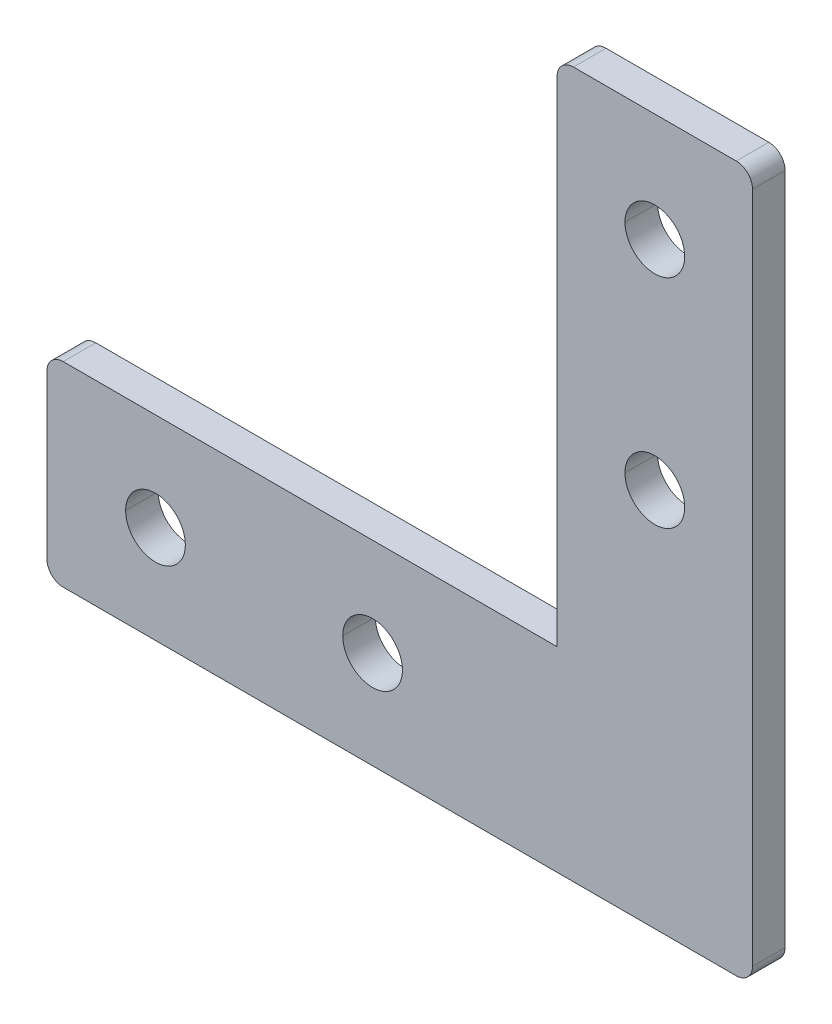
ISO-10303-21;
HEADER;
FILE_DESCRIPTION(('STEP AP214'),'2;1');
FILE_NAME('part.step','',(''),(''),'','','');
FILE_SCHEMA(('AUTOMOTIVE_DESIGN { 1 0 10303 214 1 1 1 1 }'));
ENDSEC;
DATA;
#1=APPLICATION_CONTEXT('core data for automotive mechanical design processes');
#2=APPLICATION_PROTOCOL_DEFINITION('international standard','automotive_design',2000,#1);
#3=PRODUCT_CONTEXT('',#1,'mechanical');
#4=PRODUCT('Part','Part','',(#3));
#5=PRODUCT_RELATED_PRODUCT_CATEGORY('part','',(#4));
#6=PRODUCT_DEFINITION_FORMATION('','',#4);
#7=PRODUCT_DEFINITION_CONTEXT('part definition',#1,'design');
#8=PRODUCT_DEFINITION('design','',#6,#7);
#9=PRODUCT_DEFINITION_SHAPE('','',#8);
#10=(LENGTH_UNIT() NAMED_UNIT(*) SI_UNIT(.MILLI.,.METRE.));
#11=(NAMED_UNIT(*) PLANE_ANGLE_UNIT() SI_UNIT($,.RADIAN.));
#12=(NAMED_UNIT(*) SI_UNIT($,.STERADIAN.) SOLID_ANGLE_UNIT());
#13=UNCERTAINTY_MEASURE_WITH_UNIT(LENGTH_MEASURE(1.E-05),#10,'distance_accuracy_value','');
#14=(GEOMETRIC_REPRESENTATION_CONTEXT(3) GLOBAL_UNCERTAINTY_ASSIGNED_CONTEXT((#13)) GLOBAL_UNIT_ASSIGNED_CONTEXT((#10,
#11,#12)) REPRESENTATION_CONTEXT('',''));
#15=CARTESIAN_POINT('',(0.,0.,0.));
#16=DIRECTION('',(0.,0.,1.));
#17=DIRECTION('',(1.,0.,0.));
#18=AXIS2_PLACEMENT_3D('',#15,#16,#17);
#19=CARTESIAN_POINT('',(56.,55.,-3.));
#20=DIRECTION('',(0.,0.,1.));
#21=DIRECTION('',(1.,0.,0.));
#22=AXIS2_PLACEMENT_3D('',#19,#20,#21);
#23=CYLINDRICAL_SURFACE('',#22,2.75);
#24=DIRECTION('',(0.,0.,1.));
#25=VECTOR('',#24,1.);
#26=CARTESIAN_POINT('',(53.25,55.,-3.));
#27=LINE('',#26,#25);
#28=CARTESIAN_POINT('',(53.25,55.,-3.));
#29=VERTEX_POINT('',#28);
#30=CARTESIAN_POINT('',(53.25,55.,0.));
#31=VERTEX_POINT('',#30);
#32=EDGE_CURVE('E266',#29,#31,#27,.T.);
#33=ORIENTED_EDGE('',*,*,#32,.F.);
#34=CARTESIAN_POINT('',(56.,55.,-3.));
#35=DIRECTION('',(0.,0.,1.));
#36=DIRECTION('',(1.,0.,0.));
#37=AXIS2_PLACEMENT_3D('',#34,#35,#36);
#38=CIRCLE('',#37,2.75);
#39=CARTESIAN_POINT('',(58.75,55.,-3.));
#40=VERTEX_POINT('',#39);
#41=EDGE_CURVE('E378',#40,#29,#38,.T.);
#42=ORIENTED_EDGE('',*,*,#41,.F.);
#43=DIRECTION('',(0.,0.,1.));
#44=VECTOR('',#43,1.);
#45=CARTESIAN_POINT('',(58.75,55.,-3.));
#46=LINE('',#45,#44);
#47=CARTESIAN_POINT('',(58.75,55.,0.));
#48=VERTEX_POINT('',#47);
#49=EDGE_CURVE('E229',#40,#48,#46,.T.);
#50=ORIENTED_EDGE('',*,*,#49,.T.);
#51=CARTESIAN_POINT('',(56.,55.,0.));
#52=DIRECTION('',(0.,0.,1.));
#53=DIRECTION('',(1.,0.,0.));
#54=AXIS2_PLACEMENT_3D('',#51,#52,#53);
#55=CIRCLE('',#54,2.75);
#56=EDGE_CURVE('E212',#48,#31,#55,.T.);
#57=ORIENTED_EDGE('',*,*,#56,.T.);
#58=EDGE_LOOP('',(#33,#42,#50,#57));
#59=FACE_BOUND('',#58,.T.);
#60=ADVANCED_FACE('F16',(#59),#23,.F.);
#61=CARTESIAN_POINT('',(56.,35.,-3.));
#62=DIRECTION('',(0.,0.,1.));
#63=DIRECTION('',(1.,0.,0.));
#64=AXIS2_PLACEMENT_3D('',#61,#62,#63);
#65=CYLINDRICAL_SURFACE('',#64,2.75);
#66=DIRECTION('',(0.,0.,1.));
#67=VECTOR('',#66,1.);
#68=CARTESIAN_POINT('',(53.25,35.,-3.));
#69=LINE('',#68,#67);
#70=CARTESIAN_POINT('',(53.25,35.,-3.));
#71=VERTEX_POINT('',#70);
#72=CARTESIAN_POINT('',(53.25,35.,0.));
#73=VERTEX_POINT('',#72);
#74=EDGE_CURVE('E205',#71,#73,#69,.T.);
#75=ORIENTED_EDGE('',*,*,#74,.F.);
#76=CARTESIAN_POINT('',(56.,35.,-3.));
#77=DIRECTION('',(0.,0.,1.));
#78=DIRECTION('',(1.,0.,0.));
#79=AXIS2_PLACEMENT_3D('',#76,#77,#78);
#80=CIRCLE('',#79,2.75);
#81=CARTESIAN_POINT('',(58.75,35.,-3.));
#82=VERTEX_POINT('',#81);
#83=EDGE_CURVE('E258',#82,#71,#80,.T.);
#84=ORIENTED_EDGE('',*,*,#83,.F.);
#85=DIRECTION('',(0.,0.,1.));
#86=VECTOR('',#85,1.);
#87=CARTESIAN_POINT('',(58.75,35.,-3.));
#88=LINE('',#87,#86);
#89=CARTESIAN_POINT('',(58.75,35.,0.));
#90=VERTEX_POINT('',#89);
#91=EDGE_CURVE('E208',#82,#90,#88,.T.);
#92=ORIENTED_EDGE('',*,*,#91,.T.);
#93=CARTESIAN_POINT('',(56.,35.,0.));
#94=DIRECTION('',(0.,0.,1.));
#95=DIRECTION('',(1.,0.,0.));
#96=AXIS2_PLACEMENT_3D('',#93,#94,#95);
#97=CIRCLE('',#96,2.75);
#98=EDGE_CURVE('E201',#90,#73,#97,.T.);
#99=ORIENTED_EDGE('',*,*,#98,.T.);
#100=EDGE_LOOP('',(#75,#84,#92,#99));
#101=FACE_BOUND('',#100,.T.);
#102=ADVANCED_FACE('F203',(#101),#65,.F.);
#103=CARTESIAN_POINT('',(30.,9.,-3.));
#104=DIRECTION('',(0.,0.,1.));
#105=DIRECTION('',(1.,0.,0.));
#106=AXIS2_PLACEMENT_3D('',#103,#104,#105);
#107=CYLINDRICAL_SURFACE('',#106,2.75);
#108=DIRECTION('',(0.,0.,1.));
#109=VECTOR('',#108,1.);
#110=CARTESIAN_POINT('',(27.25,9.,-3.));
#111=LINE('',#110,#109);
#112=CARTESIAN_POINT('',(27.25,9.,-3.));
#113=VERTEX_POINT('',#112);
#114=CARTESIAN_POINT('',(27.25,9.,0.));
#115=VERTEX_POINT('',#114);
#116=EDGE_CURVE('E314',#113,#115,#111,.T.);
#117=ORIENTED_EDGE('',*,*,#116,.F.);
#118=CARTESIAN_POINT('',(30.,9.,-3.));
#119=DIRECTION('',(0.,0.,1.));
#120=DIRECTION('',(1.,0.,0.));
#121=AXIS2_PLACEMENT_3D('',#118,#119,#120);
#122=CIRCLE('',#121,2.75);
#123=CARTESIAN_POINT('',(32.75,9.,-3.));
#124=VERTEX_POINT('',#123);
#125=EDGE_CURVE('E254',#124,#113,#122,.T.);
#126=ORIENTED_EDGE('',*,*,#125,.F.);
#127=DIRECTION('',(0.,0.,1.));
#128=VECTOR('',#127,1.);
#129=CARTESIAN_POINT('',(32.75,9.,-3.));
#130=LINE('',#129,#128);
#131=CARTESIAN_POINT('',(32.75,9.,0.));
#132=VERTEX_POINT('',#131);
#133=EDGE_CURVE('E285',#124,#132,#130,.T.);
#134=ORIENTED_EDGE('',*,*,#133,.T.);
#135=CARTESIAN_POINT('',(30.,9.,0.));
#136=DIRECTION('',(0.,0.,1.));
#137=DIRECTION('',(1.,0.,0.));
#138=AXIS2_PLACEMENT_3D('',#135,#136,#137);
#139=CIRCLE('',#138,2.75);
#140=EDGE_CURVE('E27',#132,#115,#139,.T.);
#141=ORIENTED_EDGE('',*,*,#140,.T.);
#142=EDGE_LOOP('',(#117,#126,#134,#141));
#143=FACE_BOUND('',#142,.T.);
#144=ADVANCED_FACE('F694',(#143),#107,.F.);
#145=CARTESIAN_POINT('',(10.,9.,-3.));
#146=DIRECTION('',(0.,0.,1.));
#147=DIRECTION('',(1.,0.,0.));
#148=AXIS2_PLACEMENT_3D('',#145,#146,#147);
#149=CYLINDRICAL_SURFACE('',#148,2.75);
#150=DIRECTION('',(0.,0.,1.));
#151=VECTOR('',#150,1.);
#152=CARTESIAN_POINT('',(7.25,9.,-3.));
#153=LINE('',#152,#151);
#154=CARTESIAN_POINT('',(7.25,9.,-3.));
#155=VERTEX_POINT('',#154);
#156=CARTESIAN_POINT('',(7.25,9.,0.));
#157=VERTEX_POINT('',#156);
#158=EDGE_CURVE('E313',#155,#157,#153,.T.);
#159=ORIENTED_EDGE('',*,*,#158,.F.);
#160=CARTESIAN_POINT('',(10.,9.,-3.));
#161=DIRECTION('',(0.,0.,1.));
#162=DIRECTION('',(1.,0.,0.));
#163=AXIS2_PLACEMENT_3D('',#160,#161,#162);
#164=CIRCLE('',#163,2.75);
#165=CARTESIAN_POINT('',(12.75,9.,-3.));
#166=VERTEX_POINT('',#165);
#167=EDGE_CURVE('E257',#166,#155,#164,.T.);
#168=ORIENTED_EDGE('',*,*,#167,.F.);
#169=DIRECTION('',(0.,0.,1.));
#170=VECTOR('',#169,1.);
#171=CARTESIAN_POINT('',(12.75,9.,-3.));
#172=LINE('',#171,#170);
#173=CARTESIAN_POINT('',(12.75,9.,0.));
#174=VERTEX_POINT('',#173);
#175=EDGE_CURVE('E272',#166,#174,#172,.T.);
#176=ORIENTED_EDGE('',*,*,#175,.T.);
#177=CARTESIAN_POINT('',(10.,9.,0.));
#178=DIRECTION('',(0.,0.,1.));
#179=DIRECTION('',(1.,0.,0.));
#180=AXIS2_PLACEMENT_3D('',#177,#178,#179);
#181=CIRCLE('',#180,2.75);
#182=EDGE_CURVE('E10',#174,#157,#181,.T.);
#183=ORIENTED_EDGE('',*,*,#182,.T.);
#184=EDGE_LOOP('',(#159,#168,#176,#183));
#185=FACE_BOUND('',#184,.T.);
#186=ADVANCED_FACE('F685',(#185),#149,.F.);
#187=CARTESIAN_POINT('',(1.5,16.5,0.));
#188=DIRECTION('',(0.,0.,1.));
#189=DIRECTION('',(1.,0.,0.));
#190=AXIS2_PLACEMENT_3D('',#187,#188,#189);
#191=PLANE('',#190);
#192=ORIENTED_EDGE('',*,*,#182,.F.);
#193=CARTESIAN_POINT('',(10.,9.,0.));
#194=DIRECTION('',(0.,0.,1.));
#195=DIRECTION('',(1.,0.,0.));
#196=AXIS2_PLACEMENT_3D('',#193,#194,#195);
#197=CIRCLE('',#196,2.75);
#198=EDGE_CURVE('E276',#157,#174,#197,.T.);
#199=ORIENTED_EDGE('',*,*,#198,.F.);
#200=EDGE_LOOP('',(#192,#199));
#201=FACE_BOUND('',#200,.T.);
#202=ORIENTED_EDGE('',*,*,#140,.F.);
#203=CARTESIAN_POINT('',(30.,9.,0.));
#204=DIRECTION('',(0.,0.,1.));
#205=DIRECTION('',(1.,0.,0.));
#206=AXIS2_PLACEMENT_3D('',#203,#204,#205);
#207=CIRCLE('',#206,2.75);
#208=EDGE_CURVE('E290',#115,#132,#207,.T.);
#209=ORIENTED_EDGE('',*,*,#208,.F.);
#210=EDGE_LOOP('',(#202,#209));
#211=FACE_BOUND('',#210,.T.);
#212=ORIENTED_EDGE('',*,*,#98,.F.);
#213=CARTESIAN_POINT('',(56.,35.,0.));
#214=DIRECTION('',(0.,0.,1.));
#215=DIRECTION('',(1.,0.,0.));
#216=AXIS2_PLACEMENT_3D('',#213,#214,#215);
#217=CIRCLE('',#216,2.75);
#218=EDGE_CURVE('E214',#73,#90,#217,.T.);
#219=ORIENTED_EDGE('',*,*,#218,.F.);
#220=EDGE_LOOP('',(#212,#219));
#221=FACE_BOUND('',#220,.T.);
#222=ORIENTED_EDGE('',*,*,#56,.F.);
#223=CARTESIAN_POINT('',(56.,55.,0.));
#224=DIRECTION('',(0.,0.,1.));
#225=DIRECTION('',(1.,0.,0.));
#226=AXIS2_PLACEMENT_3D('',#223,#224,#225);
#227=CIRCLE('',#226,2.75);
#228=EDGE_CURVE('E269',#31,#48,#227,.T.);
#229=ORIENTED_EDGE('',*,*,#228,.F.);
#230=EDGE_LOOP('',(#222,#229));
#231=FACE_BOUND('',#230,.T.);
#232=CARTESIAN_POINT('',(1.5,16.5,0.));
#233=DIRECTION('',(0.,0.,1.));
#234=DIRECTION('',(1.,0.,0.));
#235=AXIS2_PLACEMENT_3D('',#232,#233,#234);
#236=CIRCLE('',#235,1.5);
#237=CARTESIAN_POINT('',(1.5,18.,0.));
#238=VERTEX_POINT('',#237);
#239=CARTESIAN_POINT('',(0.,16.5,0.));
#240=VERTEX_POINT('',#239);
#241=EDGE_CURVE('E244',#238,#240,#236,.T.);
#242=ORIENTED_EDGE('',*,*,#241,.T.);
#243=DIRECTION('',(0.,-1.,0.));
#244=VECTOR('',#243,1.);
#245=CARTESIAN_POINT('',(0.,16.5,0.));
#246=LINE('',#245,#244);
#247=CARTESIAN_POINT('',(0.,1.5,0.));
#248=VERTEX_POINT('',#247);
#249=EDGE_CURVE('E281',#240,#248,#246,.T.);
#250=ORIENTED_EDGE('',*,*,#249,.T.);
#251=CARTESIAN_POINT('',(1.5,1.5,0.));
#252=DIRECTION('',(0.,0.,1.));
#253=DIRECTION('',(1.,0.,0.));
#254=AXIS2_PLACEMENT_3D('',#251,#252,#253);
#255=CIRCLE('',#254,1.5);
#256=CARTESIAN_POINT('',(1.5,0.,0.));
#257=VERTEX_POINT('',#256);
#258=EDGE_CURVE('E294',#248,#257,#255,.T.);
#259=ORIENTED_EDGE('',*,*,#258,.T.);
#260=DIRECTION('',(1.,0.,0.));
#261=VECTOR('',#260,1.);
#262=CARTESIAN_POINT('',(1.5,0.,0.));
#263=LINE('',#262,#261);
#264=CARTESIAN_POINT('',(63.5,0.,0.));
#265=VERTEX_POINT('',#264);
#266=EDGE_CURVE('E264',#257,#265,#263,.T.);
#267=ORIENTED_EDGE('',*,*,#266,.T.);
#268=CARTESIAN_POINT('',(63.5,1.5,0.));
#269=DIRECTION('',(0.,0.,1.));
#270=DIRECTION('',(1.,0.,0.));
#271=AXIS2_PLACEMENT_3D('',#268,#269,#270);
#272=CIRCLE('',#271,1.5);
#273=CARTESIAN_POINT('',(65.,1.5,0.));
#274=VERTEX_POINT('',#273);
#275=EDGE_CURVE('E402',#265,#274,#272,.T.);
#276=ORIENTED_EDGE('',*,*,#275,.T.);
#277=DIRECTION('',(0.,1.,0.));
#278=VECTOR('',#277,1.);
#279=CARTESIAN_POINT('',(65.,1.5,0.));
#280=LINE('',#279,#278);
#281=CARTESIAN_POINT('',(65.,63.5,0.));
#282=VERTEX_POINT('',#281);
#283=EDGE_CURVE('E329',#274,#282,#280,.T.);
#284=ORIENTED_EDGE('',*,*,#283,.T.);
#285=CARTESIAN_POINT('',(63.5,63.5,0.));
#286=DIRECTION('',(0.,0.,1.));
#287=DIRECTION('',(1.,0.,0.));
#288=AXIS2_PLACEMENT_3D('',#285,#286,#287);
#289=CIRCLE('',#288,1.5);
#290=CARTESIAN_POINT('',(63.5,65.,0.));
#291=VERTEX_POINT('',#290);
#292=EDGE_CURVE('E114',#282,#291,#289,.T.);
#293=ORIENTED_EDGE('',*,*,#292,.T.);
#294=DIRECTION('',(-1.,0.,0.));
#295=VECTOR('',#294,1.);
#296=CARTESIAN_POINT('',(63.5,65.,0.));
#297=LINE('',#296,#295);
#298=CARTESIAN_POINT('',(48.5,65.,0.));
#299=VERTEX_POINT('',#298);
#300=EDGE_CURVE('E298',#291,#299,#297,.T.);
#301=ORIENTED_EDGE('',*,*,#300,.T.);
#302=CARTESIAN_POINT('',(48.5,63.5,0.));
#303=DIRECTION('',(0.,0.,1.));
#304=DIRECTION('',(-1.,0.,0.));
#305=AXIS2_PLACEMENT_3D('',#302,#303,#304);
#306=CIRCLE('',#305,1.5);
#307=CARTESIAN_POINT('',(47.,63.5,0.));
#308=VERTEX_POINT('',#307);
#309=EDGE_CURVE('E248',#299,#308,#306,.T.);
#310=ORIENTED_EDGE('',*,*,#309,.T.);
#311=DIRECTION('',(0.,-1.,0.));
#312=VECTOR('',#311,1.);
#313=CARTESIAN_POINT('',(47.,63.5,0.));
#314=LINE('',#313,#312);
#315=CARTESIAN_POINT('',(47.,18.,0.));
#316=VERTEX_POINT('',#315);
#317=EDGE_CURVE('E277',#308,#316,#314,.T.);
#318=ORIENTED_EDGE('',*,*,#317,.T.);
#319=DIRECTION('',(-1.,0.,0.));
#320=VECTOR('',#319,1.);
#321=CARTESIAN_POINT('',(47.,18.,0.));
#322=LINE('',#321,#320);
#323=EDGE_CURVE('E238',#316,#238,#322,.T.);
#324=ORIENTED_EDGE('',*,*,#323,.T.);
#325=EDGE_LOOP('',(#242,#250,#259,#267,#276,#284,#293,#301,#310,#318,#324));
#326=FACE_BOUND('',#325,.T.);
#327=ADVANCED_FACE('F215',(#201,#211,#221,#231,#326),#191,.T.);
#328=CARTESIAN_POINT('',(1.5,16.5,-3.));
#329=DIRECTION('',(0.,0.,1.));
#330=DIRECTION('',(1.,0.,0.));
#331=AXIS2_PLACEMENT_3D('',#328,#329,#330);
#332=PLANE('',#331);
#333=ORIENTED_EDGE('',*,*,#167,.T.);
#334=CARTESIAN_POINT('',(10.,9.,-3.));
#335=DIRECTION('',(0.,0.,1.));
#336=DIRECTION('',(1.,0.,0.));
#337=AXIS2_PLACEMENT_3D('',#334,#335,#336);
#338=CIRCLE('',#337,2.75);
#339=EDGE_CURVE('E289',#155,#166,#338,.T.);
#340=ORIENTED_EDGE('',*,*,#339,.T.);
#341=EDGE_LOOP('',(#333,#340));
#342=FACE_BOUND('',#341,.T.);
#343=ORIENTED_EDGE('',*,*,#125,.T.);
#344=CARTESIAN_POINT('',(30.,9.,-3.));
#345=DIRECTION('',(0.,0.,1.));
#346=DIRECTION('',(1.,0.,0.));
#347=AXIS2_PLACEMENT_3D('',#344,#345,#346);
#348=CIRCLE('',#347,2.75);
#349=EDGE_CURVE('E20',#113,#124,#348,.T.);
#350=ORIENTED_EDGE('',*,*,#349,.T.);
#351=EDGE_LOOP('',(#343,#350));
#352=FACE_BOUND('',#351,.T.);
#353=ORIENTED_EDGE('',*,*,#83,.T.);
#354=CARTESIAN_POINT('',(56.,35.,-3.));
#355=DIRECTION('',(0.,0.,1.));
#356=DIRECTION('',(1.,0.,0.));
#357=AXIS2_PLACEMENT_3D('',#354,#355,#356);
#358=CIRCLE('',#357,2.75);
#359=EDGE_CURVE('E222',#71,#82,#358,.T.);
#360=ORIENTED_EDGE('',*,*,#359,.T.);
#361=EDGE_LOOP('',(#353,#360));
#362=FACE_BOUND('',#361,.T.);
#363=ORIENTED_EDGE('',*,*,#41,.T.);
#364=CARTESIAN_POINT('',(56.,55.,-3.));
#365=DIRECTION('',(0.,0.,1.));
#366=DIRECTION('',(1.,0.,0.));
#367=AXIS2_PLACEMENT_3D('',#364,#365,#366);
#368=CIRCLE('',#367,2.75);
#369=EDGE_CURVE('E270',#29,#40,#368,.T.);
#370=ORIENTED_EDGE('',*,*,#369,.T.);
#371=EDGE_LOOP('',(#363,#370));
#372=FACE_BOUND('',#371,.T.);
#373=CARTESIAN_POINT('',(1.5,16.5,-3.));
#374=DIRECTION('',(0.,0.,1.));
#375=DIRECTION('',(1.,0.,0.));
#376=AXIS2_PLACEMENT_3D('',#373,#374,#375);
#377=CIRCLE('',#376,1.5);
#378=CARTESIAN_POINT('',(1.5,18.,-3.));
#379=VERTEX_POINT('',#378);
#380=CARTESIAN_POINT('',(0.,16.5,-3.));
#381=VERTEX_POINT('',#380);
#382=EDGE_CURVE('E239',#379,#381,#377,.T.);
#383=ORIENTED_EDGE('',*,*,#382,.F.);
#384=DIRECTION('',(-1.,0.,0.));
#385=VECTOR('',#384,1.);
#386=CARTESIAN_POINT('',(47.,18.,-3.));
#387=LINE('',#386,#385);
#388=CARTESIAN_POINT('',(47.,18.,-3.));
#389=VERTEX_POINT('',#388);
#390=EDGE_CURVE('E280',#389,#379,#387,.T.);
#391=ORIENTED_EDGE('',*,*,#390,.F.);
#392=DIRECTION('',(0.,-1.,0.));
#393=VECTOR('',#392,1.);
#394=CARTESIAN_POINT('',(47.,63.5,-3.));
#395=LINE('',#394,#393);
#396=CARTESIAN_POINT('',(47.,63.5,-3.));
#397=VERTEX_POINT('',#396);
#398=EDGE_CURVE('E245',#397,#389,#395,.T.);
#399=ORIENTED_EDGE('',*,*,#398,.F.);
#400=CARTESIAN_POINT('',(48.5,63.5,-3.));
#401=DIRECTION('',(0.,0.,1.));
#402=DIRECTION('',(-1.,0.,0.));
#403=AXIS2_PLACEMENT_3D('',#400,#401,#402);
#404=CIRCLE('',#403,1.5);
#405=CARTESIAN_POINT('',(48.5,65.,-3.));
#406=VERTEX_POINT('',#405);
#407=EDGE_CURVE('E295',#406,#397,#404,.T.);
#408=ORIENTED_EDGE('',*,*,#407,.F.);
#409=DIRECTION('',(-1.,0.,0.));
#410=VECTOR('',#409,1.);
#411=CARTESIAN_POINT('',(63.5,65.,-3.));
#412=LINE('',#411,#410);
#413=CARTESIAN_POINT('',(63.5,65.,-3.));
#414=VERTEX_POINT('',#413);
#415=EDGE_CURVE('E253',#414,#406,#412,.T.);
#416=ORIENTED_EDGE('',*,*,#415,.F.);
#417=CARTESIAN_POINT('',(63.5,63.5,-3.));
#418=DIRECTION('',(0.,0.,1.));
#419=DIRECTION('',(1.,0.,0.));
#420=AXIS2_PLACEMENT_3D('',#417,#418,#419);
#421=CIRCLE('',#420,1.5);
#422=CARTESIAN_POINT('',(65.,63.5,-3.));
#423=VERTEX_POINT('',#422);
#424=EDGE_CURVE('E126',#423,#414,#421,.T.);
#425=ORIENTED_EDGE('',*,*,#424,.F.);
#426=DIRECTION('',(0.,1.,0.));
#427=VECTOR('',#426,1.);
#428=CARTESIAN_POINT('',(65.,1.5,-3.));
#429=LINE('',#428,#427);
#430=CARTESIAN_POINT('',(65.,1.5,-3.));
#431=VERTEX_POINT('',#430);
#432=EDGE_CURVE('E334',#431,#423,#429,.T.);
#433=ORIENTED_EDGE('',*,*,#432,.F.);
#434=CARTESIAN_POINT('',(63.5,1.5,-3.));
#435=DIRECTION('',(0.,0.,1.));
#436=DIRECTION('',(1.,0.,0.));
#437=AXIS2_PLACEMENT_3D('',#434,#435,#436);
#438=CIRCLE('',#437,1.5);
#439=CARTESIAN_POINT('',(63.5,0.,-3.));
#440=VERTEX_POINT('',#439);
#441=EDGE_CURVE('E261',#440,#431,#438,.T.);
#442=ORIENTED_EDGE('',*,*,#441,.F.);
#443=DIRECTION('',(1.,0.,0.));
#444=VECTOR('',#443,1.);
#445=CARTESIAN_POINT('',(1.5,0.,-3.));
#446=LINE('',#445,#444);
#447=CARTESIAN_POINT('',(1.5,0.,-3.));
#448=VERTEX_POINT('',#447);
#449=EDGE_CURVE('E304',#448,#440,#446,.T.);
#450=ORIENTED_EDGE('',*,*,#449,.F.);
#451=CARTESIAN_POINT('',(1.5,1.5,-3.));
#452=DIRECTION('',(0.,0.,1.));
#453=DIRECTION('',(1.,0.,0.));
#454=AXIS2_PLACEMENT_3D('',#451,#452,#453);
#455=CIRCLE('',#454,1.5);
#456=CARTESIAN_POINT('',(0.,1.5,-3.));
#457=VERTEX_POINT('',#456);
#458=EDGE_CURVE('E284',#457,#448,#455,.T.);
#459=ORIENTED_EDGE('',*,*,#458,.F.);
#460=DIRECTION('',(0.,-1.,0.));
#461=VECTOR('',#460,1.);
#462=CARTESIAN_POINT('',(0.,16.5,-3.));
#463=LINE('',#462,#461);
#464=EDGE_CURVE('E42',#381,#457,#463,.T.);
#465=ORIENTED_EDGE('',*,*,#464,.F.);
#466=EDGE_LOOP('',(#383,#391,#399,#408,#416,#425,#433,#442,#450,#459,#465));
#467=FACE_BOUND('',#466,.T.);
#468=ADVANCED_FACE('F426',(#342,#352,#362,#372,#467),#332,.F.);
#469=CARTESIAN_POINT('',(0.,16.5,-3.));
#470=DIRECTION('',(-1.,0.,0.));
#471=DIRECTION('',(0.,0.,1.));
#472=AXIS2_PLACEMENT_3D('',#469,#470,#471);
#473=PLANE('',#472);
#474=ORIENTED_EDGE('',*,*,#249,.F.);
#475=DIRECTION('',(0.,0.,1.));
#476=VECTOR('',#475,1.);
#477=CARTESIAN_POINT('',(0.,16.5,-3.));
#478=LINE('',#477,#476);
#479=EDGE_CURVE('E234',#381,#240,#478,.T.);
#480=ORIENTED_EDGE('',*,*,#479,.F.);
#481=ORIENTED_EDGE('',*,*,#464,.T.);
#482=DIRECTION('',(0.,0.,1.));
#483=VECTOR('',#482,1.);
#484=CARTESIAN_POINT('',(0.,1.5,-3.));
#485=LINE('',#484,#483);
#486=EDGE_CURVE('E291',#457,#248,#485,.T.);
#487=ORIENTED_EDGE('',*,*,#486,.T.);
#488=EDGE_LOOP('',(#474,#480,#481,#487));
#489=FACE_BOUND('',#488,.T.);
#490=ADVANCED_FACE('F430',(#489),#473,.T.);
#491=CARTESIAN_POINT('',(1.5,1.5,-3.));
#492=DIRECTION('',(0.,0.,1.));
#493=DIRECTION('',(1.,0.,0.));
#494=AXIS2_PLACEMENT_3D('',#491,#492,#493);
#495=CYLINDRICAL_SURFACE('',#494,1.5);
#496=ORIENTED_EDGE('',*,*,#258,.F.);
#497=ORIENTED_EDGE('',*,*,#486,.F.);
#498=ORIENTED_EDGE('',*,*,#458,.T.);
#499=DIRECTION('',(0.,0.,1.));
#500=VECTOR('',#499,1.);
#501=CARTESIAN_POINT('',(1.5,0.,-3.));
#502=LINE('',#501,#500);
#503=EDGE_CURVE('E337',#448,#257,#502,.T.);
#504=ORIENTED_EDGE('',*,*,#503,.T.);
#505=EDGE_LOOP('',(#496,#497,#498,#504));
#506=FACE_BOUND('',#505,.T.);
#507=ADVANCED_FACE('F435',(#506),#495,.T.);
#508=CARTESIAN_POINT('',(1.5,0.,-3.));
#509=DIRECTION('',(0.,-1.,0.));
#510=DIRECTION('',(0.,0.,-1.));
#511=AXIS2_PLACEMENT_3D('',#508,#509,#510);
#512=PLANE('',#511);
#513=ORIENTED_EDGE('',*,*,#266,.F.);
#514=ORIENTED_EDGE('',*,*,#503,.F.);
#515=ORIENTED_EDGE('',*,*,#449,.T.);
#516=DIRECTION('',(0.,0.,1.));
#517=VECTOR('',#516,1.);
#518=CARTESIAN_POINT('',(63.5,0.,-3.));
#519=LINE('',#518,#517);
#520=EDGE_CURVE('E265',#440,#265,#519,.T.);
#521=ORIENTED_EDGE('',*,*,#520,.T.);
#522=EDGE_LOOP('',(#513,#514,#515,#521));
#523=FACE_BOUND('',#522,.T.);
#524=ADVANCED_FACE('F437',(#523),#512,.T.);
#525=CARTESIAN_POINT('',(63.5,1.5,-3.));
#526=DIRECTION('',(0.,0.,1.));
#527=DIRECTION('',(1.,0.,0.));
#528=AXIS2_PLACEMENT_3D('',#525,#526,#527);
#529=CYLINDRICAL_SURFACE('',#528,1.5);
#530=ORIENTED_EDGE('',*,*,#275,.F.);
#531=ORIENTED_EDGE('',*,*,#520,.F.);
#532=ORIENTED_EDGE('',*,*,#441,.T.);
#533=DIRECTION('',(0.,0.,1.));
#534=VECTOR('',#533,1.);
#535=CARTESIAN_POINT('',(65.,1.5,-3.));
#536=LINE('',#535,#534);
#537=EDGE_CURVE('E330',#431,#274,#536,.T.);
#538=ORIENTED_EDGE('',*,*,#537,.T.);
#539=EDGE_LOOP('',(#530,#531,#532,#538));
#540=FACE_BOUND('',#539,.T.);
#541=ADVANCED_FACE('F442',(#540),#529,.T.);
#542=CARTESIAN_POINT('',(65.,1.5,-3.));
#543=DIRECTION('',(1.,0.,0.));
#544=DIRECTION('',(0.,1.,0.));
#545=AXIS2_PLACEMENT_3D('',#542,#543,#544);
#546=PLANE('',#545);
#547=ORIENTED_EDGE('',*,*,#283,.F.);
#548=ORIENTED_EDGE('',*,*,#537,.F.);
#549=ORIENTED_EDGE('',*,*,#432,.T.);
#550=DIRECTION('',(0.,0.,1.));
#551=VECTOR('',#550,1.);
#552=CARTESIAN_POINT('',(65.,63.5,-3.));
#553=LINE('',#552,#551);
#554=EDGE_CURVE('E252',#423,#282,#553,.T.);
#555=ORIENTED_EDGE('',*,*,#554,.T.);
#556=EDGE_LOOP('',(#547,#548,#549,#555));
#557=FACE_BOUND('',#556,.T.);
#558=ADVANCED_FACE('F774',(#557),#546,.T.);
#559=CARTESIAN_POINT('',(63.5,63.5,-3.));
#560=DIRECTION('',(0.,0.,1.));
#561=DIRECTION('',(1.,0.,0.));
#562=AXIS2_PLACEMENT_3D('',#559,#560,#561);
#563=CYLINDRICAL_SURFACE('',#562,1.5);
#564=ORIENTED_EDGE('',*,*,#292,.F.);
#565=ORIENTED_EDGE('',*,*,#554,.F.);
#566=ORIENTED_EDGE('',*,*,#424,.T.);
#567=DIRECTION('',(0.,0.,1.));
#568=VECTOR('',#567,1.);
#569=CARTESIAN_POINT('',(63.5,65.,-3.));
#570=LINE('',#569,#568);
#571=EDGE_CURVE('E326',#414,#291,#570,.T.);
#572=ORIENTED_EDGE('',*,*,#571,.T.);
#573=EDGE_LOOP('',(#564,#565,#566,#572));
#574=FACE_BOUND('',#573,.T.);
#575=ADVANCED_FACE('F715',(#574),#563,.T.);
#576=CARTESIAN_POINT('',(63.5,65.,-3.));
#577=DIRECTION('',(0.,1.,0.));
#578=DIRECTION('',(1.,0.,0.));
#579=AXIS2_PLACEMENT_3D('',#576,#577,#578);
#580=PLANE('',#579);
#581=ORIENTED_EDGE('',*,*,#300,.F.);
#582=ORIENTED_EDGE('',*,*,#571,.F.);
#583=ORIENTED_EDGE('',*,*,#415,.T.);
#584=DIRECTION('',(0.,0.,1.));
#585=VECTOR('',#584,1.);
#586=CARTESIAN_POINT('',(48.5,65.,-3.));
#587=LINE('',#586,#585);
#588=EDGE_CURVE('E299',#406,#299,#587,.T.);
#589=ORIENTED_EDGE('',*,*,#588,.T.);
#590=EDGE_LOOP('',(#581,#582,#583,#589));
#591=FACE_BOUND('',#590,.T.);
#592=ADVANCED_FACE('F710',(#591),#580,.T.);
#593=CARTESIAN_POINT('',(48.5,63.5,-3.));
#594=DIRECTION('',(0.,0.,1.));
#595=DIRECTION('',(1.,0.,0.));
#596=AXIS2_PLACEMENT_3D('',#593,#594,#595);
#597=CYLINDRICAL_SURFACE('',#596,1.5);
#598=ORIENTED_EDGE('',*,*,#309,.F.);
#599=ORIENTED_EDGE('',*,*,#588,.F.);
#600=ORIENTED_EDGE('',*,*,#407,.T.);
#601=DIRECTION('',(0.,0.,1.));
#602=VECTOR('',#601,1.);
#603=CARTESIAN_POINT('',(47.,63.5,-3.));
#604=LINE('',#603,#602);
#605=EDGE_CURVE('E249',#397,#308,#604,.T.);
#606=ORIENTED_EDGE('',*,*,#605,.T.);
#607=EDGE_LOOP('',(#598,#599,#600,#606));
#608=FACE_BOUND('',#607,.T.);
#609=ADVANCED_FACE('F356',(#608),#597,.T.);
#610=CARTESIAN_POINT('',(47.,63.5,-3.));
#611=DIRECTION('',(-1.,0.,0.));
#612=DIRECTION('',(0.,0.,1.));
#613=AXIS2_PLACEMENT_3D('',#610,#611,#612);
#614=PLANE('',#613);
#615=ORIENTED_EDGE('',*,*,#317,.F.);
#616=ORIENTED_EDGE('',*,*,#605,.F.);
#617=ORIENTED_EDGE('',*,*,#398,.T.);
#618=DIRECTION('',(0.,0.,1.));
#619=VECTOR('',#618,1.);
#620=CARTESIAN_POINT('',(47.,18.,-3.));
#621=LINE('',#620,#619);
#622=EDGE_CURVE('E363',#389,#316,#621,.T.);
#623=ORIENTED_EDGE('',*,*,#622,.T.);
#624=EDGE_LOOP('',(#615,#616,#617,#623));
#625=FACE_BOUND('',#624,.T.);
#626=ADVANCED_FACE('F361',(#625),#614,.T.);
#627=CARTESIAN_POINT('',(47.,18.,-3.));
#628=DIRECTION('',(0.,1.,0.));
#629=DIRECTION('',(1.,0.,0.));
#630=AXIS2_PLACEMENT_3D('',#627,#628,#629);
#631=PLANE('',#630);
#632=ORIENTED_EDGE('',*,*,#323,.F.);
#633=ORIENTED_EDGE('',*,*,#622,.F.);
#634=ORIENTED_EDGE('',*,*,#390,.T.);
#635=DIRECTION('',(0.,0.,1.));
#636=VECTOR('',#635,1.);
#637=CARTESIAN_POINT('',(1.5,18.,-3.));
#638=LINE('',#637,#636);
#639=EDGE_CURVE('E240',#379,#238,#638,.T.);
#640=ORIENTED_EDGE('',*,*,#639,.T.);
#641=EDGE_LOOP('',(#632,#633,#634,#640));
#642=FACE_BOUND('',#641,.T.);
#643=ADVANCED_FACE('F18',(#642),#631,.T.);
#644=CARTESIAN_POINT('',(1.5,16.5,-3.));
#645=DIRECTION('',(0.,0.,1.));
#646=DIRECTION('',(1.,0.,0.));
#647=AXIS2_PLACEMENT_3D('',#644,#645,#646);
#648=CYLINDRICAL_SURFACE('',#647,1.5);
#649=ORIENTED_EDGE('',*,*,#241,.F.);
#650=ORIENTED_EDGE('',*,*,#639,.F.);
#651=ORIENTED_EDGE('',*,*,#382,.T.);
#652=ORIENTED_EDGE('',*,*,#479,.T.);
#653=EDGE_LOOP('',(#649,#650,#651,#652));
#654=FACE_BOUND('',#653,.T.);
#655=ADVANCED_FACE('F424',(#654),#648,.T.);
#656=CARTESIAN_POINT('',(10.,9.,-3.));
#657=DIRECTION('',(0.,0.,1.));
#658=DIRECTION('',(1.,0.,0.));
#659=AXIS2_PLACEMENT_3D('',#656,#657,#658);
#660=CYLINDRICAL_SURFACE('',#659,2.75);
#661=ORIENTED_EDGE('',*,*,#339,.F.);
#662=ORIENTED_EDGE('',*,*,#158,.T.);
#663=ORIENTED_EDGE('',*,*,#198,.T.);
#664=ORIENTED_EDGE('',*,*,#175,.F.);
#665=EDGE_LOOP('',(#661,#662,#663,#664));
#666=FACE_BOUND('',#665,.T.);
#667=ADVANCED_FACE('F680',(#666),#660,.F.);
#668=CARTESIAN_POINT('',(30.,9.,-3.));
#669=DIRECTION('',(0.,0.,1.));
#670=DIRECTION('',(1.,0.,0.));
#671=AXIS2_PLACEMENT_3D('',#668,#669,#670);
#672=CYLINDRICAL_SURFACE('',#671,2.75);
#673=ORIENTED_EDGE('',*,*,#349,.F.);
#674=ORIENTED_EDGE('',*,*,#116,.T.);
#675=ORIENTED_EDGE('',*,*,#208,.T.);
#676=ORIENTED_EDGE('',*,*,#133,.F.);
#677=EDGE_LOOP('',(#673,#674,#675,#676));
#678=FACE_BOUND('',#677,.T.);
#679=ADVANCED_FACE('F698',(#678),#672,.F.);
#680=CARTESIAN_POINT('',(56.,35.,-3.));
#681=DIRECTION('',(0.,0.,1.));
#682=DIRECTION('',(1.,0.,0.));
#683=AXIS2_PLACEMENT_3D('',#680,#681,#682);
#684=CYLINDRICAL_SURFACE('',#683,2.75);
#685=ORIENTED_EDGE('',*,*,#359,.F.);
#686=ORIENTED_EDGE('',*,*,#74,.T.);
#687=ORIENTED_EDGE('',*,*,#218,.T.);
#688=ORIENTED_EDGE('',*,*,#91,.F.);
#689=EDGE_LOOP('',(#685,#686,#687,#688));
#690=FACE_BOUND('',#689,.T.);
#691=ADVANCED_FACE('F220',(#690),#684,.F.);
#692=CARTESIAN_POINT('',(56.,55.,-3.));
#693=DIRECTION('',(0.,0.,1.));
#694=DIRECTION('',(1.,0.,0.));
#695=AXIS2_PLACEMENT_3D('',#692,#693,#694);
#696=CYLINDRICAL_SURFACE('',#695,2.75);
#697=ORIENTED_EDGE('',*,*,#369,.F.);
#698=ORIENTED_EDGE('',*,*,#32,.T.);
#699=ORIENTED_EDGE('',*,*,#228,.T.);
#700=ORIENTED_EDGE('',*,*,#49,.F.);
#701=EDGE_LOOP('',(#697,#698,#699,#700));
#702=FACE_BOUND('',#701,.T.);
#703=ADVANCED_FACE('F750',(#702),#696,.F.);
#704=CLOSED_SHELL('',(#60,#102,#144,#186,#327,#468,#490,#507,#524,#541,#558,#575,#592,#609,#626,
#643,#655,#667,#679,#691,#703));
#705=MANIFOLD_SOLID_BREP('B1',#704);
#706=ADVANCED_BREP_SHAPE_REPRESENTATION('',(#18,#705),#14);
#707=SHAPE_DEFINITION_REPRESENTATION(#9,#706);
ENDSEC;
END-ISO-10303-21;
